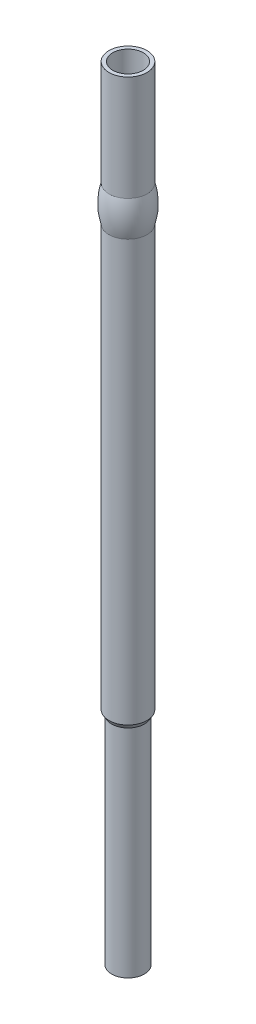
ISO-10303-21;
HEADER;
FILE_DESCRIPTION(('STEP AP214'),'2;1');
FILE_NAME('part.step','',(''),(''),'','','');
FILE_SCHEMA(('AUTOMOTIVE_DESIGN { 1 0 10303 214 1 1 1 1 }'));
ENDSEC;
DATA;
#1=APPLICATION_CONTEXT('core data for automotive mechanical design processes');
#2=APPLICATION_PROTOCOL_DEFINITION('international standard','automotive_design',2000,#1);
#3=PRODUCT_CONTEXT('',#1,'mechanical');
#4=PRODUCT('Part','Part','',(#3));
#5=PRODUCT_RELATED_PRODUCT_CATEGORY('part','',(#4));
#6=PRODUCT_DEFINITION_FORMATION('','',#4);
#7=PRODUCT_DEFINITION_CONTEXT('part definition',#1,'design');
#8=PRODUCT_DEFINITION('design','',#6,#7);
#9=PRODUCT_DEFINITION_SHAPE('','',#8);
#10=(LENGTH_UNIT() NAMED_UNIT(*) SI_UNIT(.MILLI.,.METRE.));
#11=(NAMED_UNIT(*) PLANE_ANGLE_UNIT() SI_UNIT($,.RADIAN.));
#12=(NAMED_UNIT(*) SI_UNIT($,.STERADIAN.) SOLID_ANGLE_UNIT());
#13=UNCERTAINTY_MEASURE_WITH_UNIT(LENGTH_MEASURE(1.E-05),#10,'distance_accuracy_value','');
#14=(GEOMETRIC_REPRESENTATION_CONTEXT(3) GLOBAL_UNCERTAINTY_ASSIGNED_CONTEXT((#13)) GLOBAL_UNIT_ASSIGNED_CONTEXT((#10,
#11,#12)) REPRESENTATION_CONTEXT('',''));
#15=CARTESIAN_POINT('',(0.,0.,0.));
#16=DIRECTION('',(0.,0.,1.));
#17=DIRECTION('',(1.,0.,0.));
#18=AXIS2_PLACEMENT_3D('',#15,#16,#17);
#19=CARTESIAN_POINT('',(0.,0.,-0.43));
#20=DIRECTION('',(0.,-1.,0.));
#21=DIRECTION('',(0.,0.,-1.));
#22=AXIS2_PLACEMENT_3D('',#19,#20,#21);
#23=PLANE('',#22);
#24=CARTESIAN_POINT('',(0.,0.,0.));
#25=DIRECTION('',(0.,1.,0.));
#26=DIRECTION('',(0.,0.,1.));
#27=AXIS2_PLACEMENT_3D('',#24,#25,#26);
#28=CIRCLE('',#27,0.345000000000001);
#29=CARTESIAN_POINT('',(0.,0.,0.345000000000003));
#30=VERTEX_POINT('',#29);
#31=EDGE_CURVE('E67',#30,#30,#28,.T.);
#32=ORIENTED_EDGE('',*,*,#31,.F.);
#33=EDGE_LOOP('',(#32));
#34=FACE_BOUND('',#33,.T.);
#35=CARTESIAN_POINT('',(0.,0.,0.));
#36=DIRECTION('',(0.,1.,0.));
#37=DIRECTION('',(0.,0.,1.));
#38=AXIS2_PLACEMENT_3D('',#35,#36,#37);
#39=CIRCLE('',#38,0.430000000000001);
#40=CARTESIAN_POINT('',(0.,0.,0.430000000000002));
#41=VERTEX_POINT('',#40);
#42=EDGE_CURVE('E10',#41,#41,#39,.T.);
#43=ORIENTED_EDGE('',*,*,#42,.T.);
#44=EDGE_LOOP('',(#43));
#45=FACE_BOUND('',#44,.T.);
#46=ADVANCED_FACE('F33',(#34,#45),#23,.F.);
#47=CARTESIAN_POINT('',(0.,-12.56,0.));
#48=DIRECTION('',(0.,1.,0.));
#49=DIRECTION('',(0.,0.,1.));
#50=AXIS2_PLACEMENT_3D('',#47,#48,#49);
#51=CYLINDRICAL_SURFACE('',#50,0.430000000000001);
#52=ORIENTED_EDGE('',*,*,#42,.F.);
#53=EDGE_LOOP('',(#52));
#54=FACE_BOUND('',#53,.T.);
#55=CARTESIAN_POINT('',(0.,-2.38,0.));
#56=DIRECTION('',(0.,1.,0.));
#57=DIRECTION('',(0.,0.,1.));
#58=AXIS2_PLACEMENT_3D('',#55,#56,#57);
#59=CIRCLE('',#58,0.430000000000001);
#60=CARTESIAN_POINT('',(0.,-2.38,0.430000000000001));
#61=VERTEX_POINT('',#60);
#62=EDGE_CURVE('E39',#61,#61,#59,.T.);
#63=ORIENTED_EDGE('',*,*,#62,.T.);
#64=EDGE_LOOP('',(#63));
#65=FACE_BOUND('',#64,.T.);
#66=ADVANCED_FACE('F74',(#54,#65),#51,.T.);
#67=CARTESIAN_POINT('',(0.,-2.78,0.));
#68=DIRECTION('',(0.,1.,0.));
#69=DIRECTION('',(0.,0.,1.));
#70=AXIS2_PLACEMENT_3D('',#67,#68,#69);
#71=DEGENERATE_TOROIDAL_SURFACE('',#70,0.99704545454544,1.48204545454544,.F.);
#72=ORIENTED_EDGE('',*,*,#62,.F.);
#73=EDGE_LOOP('',(#72));
#74=FACE_BOUND('',#73,.T.);
#75=CARTESIAN_POINT('',(0.,-3.18,0.));
#76=DIRECTION('',(0.,1.,0.));
#77=DIRECTION('',(0.,0.,1.));
#78=AXIS2_PLACEMENT_3D('',#75,#76,#77);
#79=CIRCLE('',#78,0.430000000000001);
#80=CARTESIAN_POINT('',(0.,-3.18,0.430000000000002));
#81=VERTEX_POINT('',#80);
#82=EDGE_CURVE('E43',#81,#81,#79,.T.);
#83=ORIENTED_EDGE('',*,*,#82,.T.);
#84=EDGE_LOOP('',(#83));
#85=FACE_BOUND('',#84,.T.);
#86=ADVANCED_FACE('F78',(#74,#85),#71,.F.);
#87=CARTESIAN_POINT('',(0.,-12.56,0.));
#88=DIRECTION('',(0.,1.,0.));
#89=DIRECTION('',(0.,0.,1.));
#90=AXIS2_PLACEMENT_3D('',#87,#88,#89);
#91=CYLINDRICAL_SURFACE('',#90,0.43);
#92=ORIENTED_EDGE('',*,*,#82,.F.);
#93=EDGE_LOOP('',(#92));
#94=FACE_BOUND('',#93,.T.);
#95=CARTESIAN_POINT('',(0.,-12.7,0.));
#96=DIRECTION('',(0.,1.,0.));
#97=DIRECTION('',(0.,0.,1.));
#98=AXIS2_PLACEMENT_3D('',#95,#96,#97);
#99=CIRCLE('',#98,0.43);
#100=CARTESIAN_POINT('',(0.,-12.7,0.429999999999999));
#101=VERTEX_POINT('',#100);
#102=EDGE_CURVE('E47',#101,#101,#99,.T.);
#103=ORIENTED_EDGE('',*,*,#102,.T.);
#104=EDGE_LOOP('',(#103));
#105=FACE_BOUND('',#104,.T.);
#106=ADVANCED_FACE('F83',(#94,#105),#91,.T.);
#107=CARTESIAN_POINT('',(0.,-12.8,0.));
#108=DIRECTION('',(0.,1.,0.));
#109=DIRECTION('',(0.,0.,1.));
#110=AXIS2_PLACEMENT_3D('',#107,#108,#109);
#111=CONICAL_SURFACE('',#110,0.370000000000001,0.54041950027058);
#112=ORIENTED_EDGE('',*,*,#102,.F.);
#113=EDGE_LOOP('',(#112));
#114=FACE_BOUND('',#113,.T.);
#115=CARTESIAN_POINT('',(0.,-12.8,0.));
#116=DIRECTION('',(0.,1.,0.));
#117=DIRECTION('',(0.,0.,1.));
#118=AXIS2_PLACEMENT_3D('',#115,#116,#117);
#119=CIRCLE('',#118,0.370000000000001);
#120=CARTESIAN_POINT('',(0.,-12.8,0.37));
#121=VERTEX_POINT('',#120);
#122=EDGE_CURVE('E52',#121,#121,#119,.T.);
#123=ORIENTED_EDGE('',*,*,#122,.T.);
#124=EDGE_LOOP('',(#123));
#125=FACE_BOUND('',#124,.T.);
#126=ADVANCED_FACE('F89',(#114,#125),#111,.T.);
#127=CARTESIAN_POINT('',(0.,-12.56,0.));
#128=DIRECTION('',(0.,1.,0.));
#129=DIRECTION('',(0.,0.,1.));
#130=AXIS2_PLACEMENT_3D('',#127,#128,#129);
#131=CYLINDRICAL_SURFACE('',#130,0.37);
#132=ORIENTED_EDGE('',*,*,#122,.F.);
#133=EDGE_LOOP('',(#132));
#134=FACE_BOUND('',#133,.T.);
#135=CARTESIAN_POINT('',(0.,-17.7,0.));
#136=DIRECTION('',(0.,1.,0.));
#137=DIRECTION('',(0.,0.,1.));
#138=AXIS2_PLACEMENT_3D('',#135,#136,#137);
#139=CIRCLE('',#138,0.369999999999999);
#140=CARTESIAN_POINT('',(0.,-17.7,0.369999999999998));
#141=VERTEX_POINT('',#140);
#142=EDGE_CURVE('E55',#141,#141,#139,.T.);
#143=ORIENTED_EDGE('',*,*,#142,.T.);
#144=EDGE_LOOP('',(#143));
#145=FACE_BOUND('',#144,.T.);
#146=ADVANCED_FACE('F93',(#134,#145),#131,.T.);
#147=CARTESIAN_POINT('',(0.,-17.7,-0.280000000000001));
#148=DIRECTION('',(0.,1.,0.));
#149=DIRECTION('',(0.,0.,1.));
#150=AXIS2_PLACEMENT_3D('',#147,#148,#149);
#151=PLANE('',#150);
#152=ORIENTED_EDGE('',*,*,#142,.F.);
#153=EDGE_LOOP('',(#152));
#154=FACE_BOUND('',#153,.T.);
#155=CARTESIAN_POINT('',(0.,-17.7,0.));
#156=DIRECTION('',(0.,1.,0.));
#157=DIRECTION('',(0.,0.,1.));
#158=AXIS2_PLACEMENT_3D('',#155,#156,#157);
#159=CIRCLE('',#158,0.28);
#160=CARTESIAN_POINT('',(0.,-17.7,0.279999999999999));
#161=VERTEX_POINT('',#160);
#162=EDGE_CURVE('E58',#161,#161,#159,.T.);
#163=ORIENTED_EDGE('',*,*,#162,.T.);
#164=EDGE_LOOP('',(#163));
#165=FACE_BOUND('',#164,.T.);
#166=ADVANCED_FACE('F97',(#154,#165),#151,.F.);
#167=CARTESIAN_POINT('',(0.,-12.56,0.));
#168=DIRECTION('',(0.,1.,0.));
#169=DIRECTION('',(0.,0.,1.));
#170=AXIS2_PLACEMENT_3D('',#167,#168,#169);
#171=CYLINDRICAL_SURFACE('',#170,0.28);
#172=ORIENTED_EDGE('',*,*,#162,.F.);
#173=EDGE_LOOP('',(#172));
#174=FACE_BOUND('',#173,.T.);
#175=CARTESIAN_POINT('',(0.,-12.8,0.));
#176=DIRECTION('',(0.,1.,0.));
#177=DIRECTION('',(0.,0.,1.));
#178=AXIS2_PLACEMENT_3D('',#175,#176,#177);
#179=CIRCLE('',#178,0.28);
#180=CARTESIAN_POINT('',(0.,-12.8,0.28));
#181=VERTEX_POINT('',#180);
#182=EDGE_CURVE('E61',#181,#181,#179,.T.);
#183=ORIENTED_EDGE('',*,*,#182,.T.);
#184=EDGE_LOOP('',(#183));
#185=FACE_BOUND('',#184,.T.);
#186=ADVANCED_FACE('F101',(#174,#185),#171,.F.);
#187=CARTESIAN_POINT('',(0.,-12.8,0.));
#188=DIRECTION('',(0.,1.,0.));
#189=DIRECTION('',(0.,0.,1.));
#190=AXIS2_PLACEMENT_3D('',#187,#188,#189);
#191=PLANE('',#190);
#192=ORIENTED_EDGE('',*,*,#182,.F.);
#193=EDGE_LOOP('',(#192));
#194=FACE_BOUND('',#193,.T.);
#195=ADVANCED_FACE('F105',(#194),#191,.F.);
#196=CARTESIAN_POINT('',(0.,-12.56,-0.345000000000002));
#197=DIRECTION('',(0.,-1.,0.));
#198=DIRECTION('',(0.,0.,-1.));
#199=AXIS2_PLACEMENT_3D('',#196,#197,#198);
#200=PLANE('',#199);
#201=CARTESIAN_POINT('',(0.,-12.56,0.));
#202=DIRECTION('',(0.,1.,0.));
#203=DIRECTION('',(0.,0.,1.));
#204=AXIS2_PLACEMENT_3D('',#201,#202,#203);
#205=CIRCLE('',#204,0.345000000000001);
#206=CARTESIAN_POINT('',(0.,-12.56,0.345000000000001));
#207=VERTEX_POINT('',#206);
#208=EDGE_CURVE('E64',#207,#207,#205,.T.);
#209=ORIENTED_EDGE('',*,*,#208,.T.);
#210=EDGE_LOOP('',(#209));
#211=FACE_BOUND('',#210,.T.);
#212=ADVANCED_FACE('F109',(#211),#200,.F.);
#213=CARTESIAN_POINT('',(0.,-12.56,0.));
#214=DIRECTION('',(0.,1.,0.));
#215=DIRECTION('',(0.,0.,1.));
#216=AXIS2_PLACEMENT_3D('',#213,#214,#215);
#217=CYLINDRICAL_SURFACE('',#216,0.345000000000001);
#218=ORIENTED_EDGE('',*,*,#208,.F.);
#219=EDGE_LOOP('',(#218));
#220=FACE_BOUND('',#219,.T.);
#221=ORIENTED_EDGE('',*,*,#31,.T.);
#222=EDGE_LOOP('',(#221));
#223=FACE_BOUND('',#222,.T.);
#224=ADVANCED_FACE('F71',(#220,#223),#217,.F.);
#225=CLOSED_SHELL('',(#46,#66,#86,#106,#126,#146,#166,#186,#195,#212,#224));
#226=MANIFOLD_SOLID_BREP('B2',#225);
#227=ADVANCED_BREP_SHAPE_REPRESENTATION('',(#18,#226),#14);
#228=SHAPE_DEFINITION_REPRESENTATION(#9,#227);
ENDSEC;
END-ISO-10303-21;
